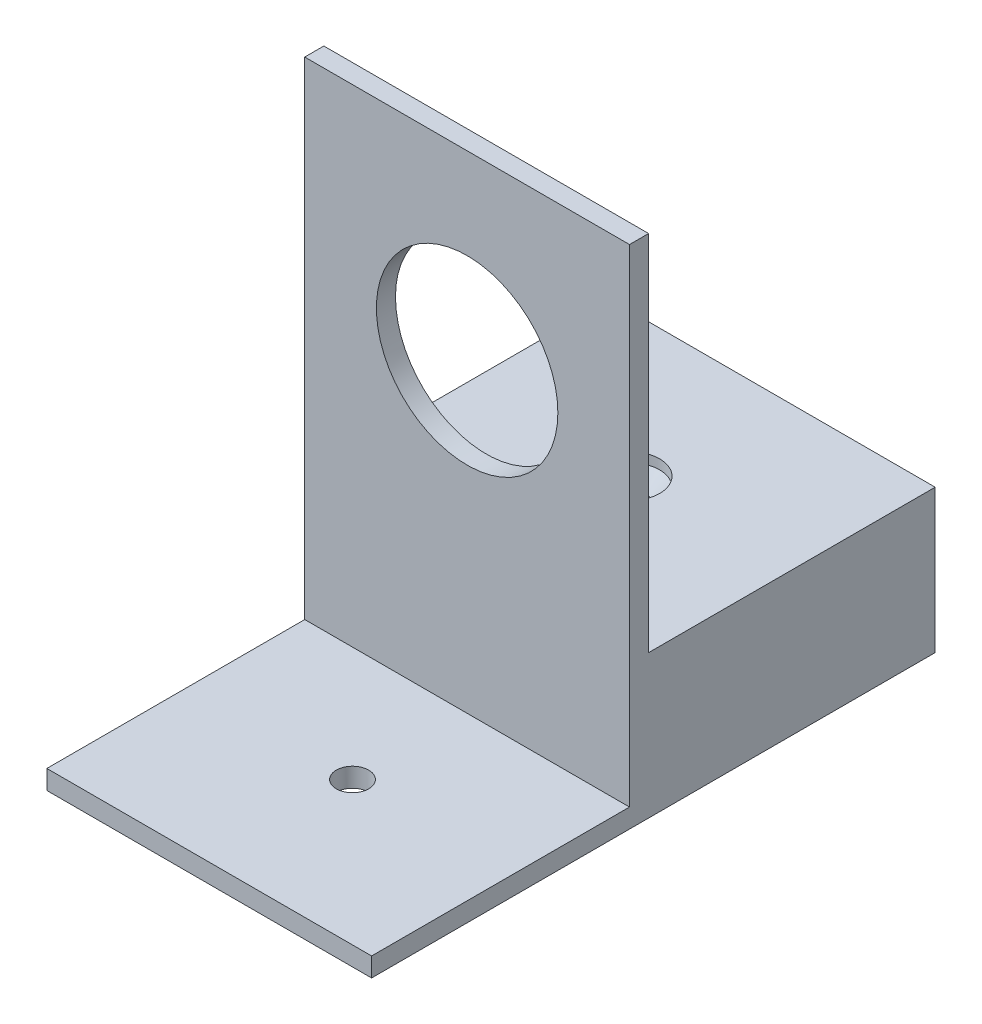
ISO-10303-21;
HEADER;
FILE_DESCRIPTION(('STEP AP214'),'2;1');
FILE_NAME('part.step','',(''),(''),'','','');
FILE_SCHEMA(('AUTOMOTIVE_DESIGN { 1 0 10303 214 1 1 1 1 }'));
ENDSEC;
DATA;
#1=APPLICATION_CONTEXT('core data for automotive mechanical design processes');
#2=APPLICATION_PROTOCOL_DEFINITION('international standard','automotive_design',2000,#1);
#3=PRODUCT_CONTEXT('',#1,'mechanical');
#4=PRODUCT('Part','Part','',(#3));
#5=PRODUCT_RELATED_PRODUCT_CATEGORY('part','',(#4));
#6=PRODUCT_DEFINITION_FORMATION('','',#4);
#7=PRODUCT_DEFINITION_CONTEXT('part definition',#1,'design');
#8=PRODUCT_DEFINITION('design','',#6,#7);
#9=PRODUCT_DEFINITION_SHAPE('','',#8);
#10=(LENGTH_UNIT() NAMED_UNIT(*) SI_UNIT(.MILLI.,.METRE.));
#11=(NAMED_UNIT(*) PLANE_ANGLE_UNIT() SI_UNIT($,.RADIAN.));
#12=(NAMED_UNIT(*) SI_UNIT($,.STERADIAN.) SOLID_ANGLE_UNIT());
#13=UNCERTAINTY_MEASURE_WITH_UNIT(LENGTH_MEASURE(1.E-05),#10,'distance_accuracy_value','');
#14=(GEOMETRIC_REPRESENTATION_CONTEXT(3) GLOBAL_UNCERTAINTY_ASSIGNED_CONTEXT((#13)) GLOBAL_UNIT_ASSIGNED_CONTEXT((#10,
#11,#12)) REPRESENTATION_CONTEXT('',''));
#15=CARTESIAN_POINT('',(0.,0.,0.));
#16=DIRECTION('',(0.,0.,1.));
#17=DIRECTION('',(1.,0.,0.));
#18=AXIS2_PLACEMENT_3D('',#15,#16,#17);
#19=CARTESIAN_POINT('',(0.,0.,2.));
#20=DIRECTION('',(0.,0.,-1.));
#21=DIRECTION('',(-1.,0.,0.));
#22=AXIS2_PLACEMENT_3D('',#19,#20,#21);
#23=PLANE('',#22);
#24=CARTESIAN_POINT('',(17.,34.,2.));
#25=DIRECTION('',(0.,0.,1.));
#26=DIRECTION('',(1.,0.,0.));
#27=AXIS2_PLACEMENT_3D('',#24,#25,#26);
#28=CIRCLE('',#27,9.5);
#29=CARTESIAN_POINT('',(26.5,34.,2.));
#30=VERTEX_POINT('',#29);
#31=EDGE_CURVE('E197',#30,#30,#28,.T.);
#32=ORIENTED_EDGE('',*,*,#31,.F.);
#33=EDGE_LOOP('',(#32));
#34=FACE_BOUND('',#33,.T.);
#35=DIRECTION('',(-1.,0.,0.));
#36=VECTOR('',#35,1.);
#37=CARTESIAN_POINT('',(0.,2.,2.));
#38=LINE('',#37,#36);
#39=CARTESIAN_POINT('',(34.,2.,2.));
#40=VERTEX_POINT('',#39);
#41=CARTESIAN_POINT('',(0.,2.,2.));
#42=VERTEX_POINT('',#41);
#43=EDGE_CURVE('E58',#40,#42,#38,.T.);
#44=ORIENTED_EDGE('',*,*,#43,.F.);
#45=DIRECTION('',(0.,1.,0.));
#46=VECTOR('',#45,1.);
#47=CARTESIAN_POINT('',(34.,0.,2.));
#48=LINE('',#47,#46);
#49=CARTESIAN_POINT('',(34.,53.,2.));
#50=VERTEX_POINT('',#49);
#51=EDGE_CURVE('E155',#40,#50,#48,.T.);
#52=ORIENTED_EDGE('',*,*,#51,.T.);
#53=DIRECTION('',(-1.,0.,0.));
#54=VECTOR('',#53,1.);
#55=CARTESIAN_POINT('',(0.,53.,2.));
#56=LINE('',#55,#54);
#57=CARTESIAN_POINT('',(0.,53.,2.));
#58=VERTEX_POINT('',#57);
#59=EDGE_CURVE('E168',#50,#58,#56,.T.);
#60=ORIENTED_EDGE('',*,*,#59,.T.);
#61=DIRECTION('',(0.,-1.,0.));
#62=VECTOR('',#61,1.);
#63=CARTESIAN_POINT('',(0.,0.,2.));
#64=LINE('',#63,#62);
#65=EDGE_CURVE('E173',#58,#42,#64,.T.);
#66=ORIENTED_EDGE('',*,*,#65,.T.);
#67=EDGE_LOOP('',(#44,#52,#60,#66));
#68=FACE_BOUND('',#67,.T.);
#69=ADVANCED_FACE('F33',(#34,#68),#23,.F.);
#70=CARTESIAN_POINT('',(0.,0.,2.));
#71=DIRECTION('',(1.,0.,0.));
#72=DIRECTION('',(0.,0.,-1.));
#73=AXIS2_PLACEMENT_3D('',#70,#71,#72);
#74=PLANE('',#73);
#75=DIRECTION('',(0.,-1.,0.));
#76=VECTOR('',#75,1.);
#77=CARTESIAN_POINT('',(0.,0.,0.));
#78=LINE('',#77,#76);
#79=CARTESIAN_POINT('',(0.,53.,0.));
#80=VERTEX_POINT('',#79);
#81=CARTESIAN_POINT('',(0.,15.,0.));
#82=VERTEX_POINT('',#81);
#83=EDGE_CURVE('E121',#80,#82,#78,.T.);
#84=ORIENTED_EDGE('',*,*,#83,.T.);
#85=DIRECTION('',(0.,0.,1.));
#86=VECTOR('',#85,1.);
#87=CARTESIAN_POINT('',(0.,15.,-30.));
#88=LINE('',#87,#86);
#89=CARTESIAN_POINT('',(0.,15.,-30.));
#90=VERTEX_POINT('',#89);
#91=EDGE_CURVE('E104',#90,#82,#88,.T.);
#92=ORIENTED_EDGE('',*,*,#91,.F.);
#93=DIRECTION('',(0.,1.,0.));
#94=VECTOR('',#93,1.);
#95=CARTESIAN_POINT('',(0.,0.,-30.));
#96=LINE('',#95,#94);
#97=CARTESIAN_POINT('',(0.,0.,-30.));
#98=VERTEX_POINT('',#97);
#99=EDGE_CURVE('E111',#98,#90,#96,.T.);
#100=ORIENTED_EDGE('',*,*,#99,.F.);
#101=DIRECTION('',(0.,0.,-1.));
#102=VECTOR('',#101,1.);
#103=CARTESIAN_POINT('',(0.,0.,2.));
#104=LINE('',#103,#102);
#105=CARTESIAN_POINT('',(0.,0.,29.));
#106=VERTEX_POINT('',#105);
#107=EDGE_CURVE('E11',#106,#98,#104,.T.);
#108=ORIENTED_EDGE('',*,*,#107,.F.);
#109=DIRECTION('',(0.,-1.,0.));
#110=VECTOR('',#109,1.);
#111=CARTESIAN_POINT('',(0.,0.,29.));
#112=LINE('',#111,#110);
#113=CARTESIAN_POINT('',(0.,2.,29.));
#114=VERTEX_POINT('',#113);
#115=EDGE_CURVE('E123',#114,#106,#112,.T.);
#116=ORIENTED_EDGE('',*,*,#115,.F.);
#117=DIRECTION('',(0.,0.,-1.));
#118=VECTOR('',#117,1.);
#119=CARTESIAN_POINT('',(0.,2.,29.));
#120=LINE('',#119,#118);
#121=EDGE_CURVE('E148',#114,#42,#120,.T.);
#122=ORIENTED_EDGE('',*,*,#121,.T.);
#123=ORIENTED_EDGE('',*,*,#65,.F.);
#124=DIRECTION('',(0.,0.,-1.));
#125=VECTOR('',#124,1.);
#126=CARTESIAN_POINT('',(0.,53.,2.));
#127=LINE('',#126,#125);
#128=EDGE_CURVE('E174',#58,#80,#127,.T.);
#129=ORIENTED_EDGE('',*,*,#128,.T.);
#130=EDGE_LOOP('',(#84,#92,#100,#108,#116,#122,#123,#129));
#131=FACE_BOUND('',#130,.T.);
#132=ADVANCED_FACE('F35',(#131),#74,.F.);
#133=CARTESIAN_POINT('',(0.,0.,2.));
#134=DIRECTION('',(0.,1.,0.));
#135=DIRECTION('',(0.,0.,1.));
#136=AXIS2_PLACEMENT_3D('',#133,#134,#135);
#137=PLANE('',#136);
#138=CARTESIAN_POINT('',(17.,0.,-15.));
#139=DIRECTION('',(0.,1.,0.));
#140=DIRECTION('',(0.,0.,1.));
#141=AXIS2_PLACEMENT_3D('',#138,#139,#140);
#142=CIRCLE('',#141,1.7);
#143=CARTESIAN_POINT('',(17.,0.,-13.3));
#144=VERTEX_POINT('',#143);
#145=EDGE_CURVE('E206',#144,#144,#142,.T.);
#146=ORIENTED_EDGE('',*,*,#145,.T.);
#147=EDGE_LOOP('',(#146));
#148=FACE_BOUND('',#147,.T.);
#149=CARTESIAN_POINT('',(17.,0.,14.));
#150=DIRECTION('',(0.,1.,0.));
#151=DIRECTION('',(0.,0.,1.));
#152=AXIS2_PLACEMENT_3D('',#149,#150,#151);
#153=CIRCLE('',#152,1.7);
#154=CARTESIAN_POINT('',(17.,0.,15.7));
#155=VERTEX_POINT('',#154);
#156=EDGE_CURVE('E203',#155,#155,#153,.T.);
#157=ORIENTED_EDGE('',*,*,#156,.T.);
#158=EDGE_LOOP('',(#157));
#159=FACE_BOUND('',#158,.T.);
#160=ORIENTED_EDGE('',*,*,#107,.T.);
#161=DIRECTION('',(-1.,0.,0.));
#162=VECTOR('',#161,1.);
#163=CARTESIAN_POINT('',(0.,0.,-30.));
#164=LINE('',#163,#162);
#165=CARTESIAN_POINT('',(34.,0.,-30.));
#166=VERTEX_POINT('',#165);
#167=EDGE_CURVE('E117',#166,#98,#164,.T.);
#168=ORIENTED_EDGE('',*,*,#167,.F.);
#169=DIRECTION('',(0.,0.,-1.));
#170=VECTOR('',#169,1.);
#171=CARTESIAN_POINT('',(34.,0.,2.));
#172=LINE('',#171,#170);
#173=CARTESIAN_POINT('',(34.,0.,29.));
#174=VERTEX_POINT('',#173);
#175=EDGE_CURVE('E42',#174,#166,#172,.T.);
#176=ORIENTED_EDGE('',*,*,#175,.F.);
#177=DIRECTION('',(1.,0.,0.));
#178=VECTOR('',#177,1.);
#179=CARTESIAN_POINT('',(0.,0.,29.));
#180=LINE('',#179,#178);
#181=EDGE_CURVE('E141',#106,#174,#180,.T.);
#182=ORIENTED_EDGE('',*,*,#181,.F.);
#183=EDGE_LOOP('',(#160,#168,#176,#182));
#184=FACE_BOUND('',#183,.T.);
#185=ADVANCED_FACE('F240',(#148,#159,#184),#137,.F.);
#186=CARTESIAN_POINT('',(34.,0.,2.));
#187=DIRECTION('',(-1.,0.,0.));
#188=DIRECTION('',(0.,0.,1.));
#189=AXIS2_PLACEMENT_3D('',#186,#187,#188);
#190=PLANE('',#189);
#191=ORIENTED_EDGE('',*,*,#175,.T.);
#192=DIRECTION('',(0.,-1.,0.));
#193=VECTOR('',#192,1.);
#194=CARTESIAN_POINT('',(34.,0.,-30.));
#195=LINE('',#194,#193);
#196=CARTESIAN_POINT('',(34.,15.,-30.));
#197=VERTEX_POINT('',#196);
#198=EDGE_CURVE('E110',#197,#166,#195,.T.);
#199=ORIENTED_EDGE('',*,*,#198,.F.);
#200=DIRECTION('',(0.,0.,1.));
#201=VECTOR('',#200,1.);
#202=CARTESIAN_POINT('',(34.,15.,-30.));
#203=LINE('',#202,#201);
#204=CARTESIAN_POINT('',(34.,15.,0.));
#205=VERTEX_POINT('',#204);
#206=EDGE_CURVE('E106',#197,#205,#203,.T.);
#207=ORIENTED_EDGE('',*,*,#206,.T.);
#208=DIRECTION('',(0.,1.,0.));
#209=VECTOR('',#208,1.);
#210=CARTESIAN_POINT('',(34.,0.,0.));
#211=LINE('',#210,#209);
#212=CARTESIAN_POINT('',(34.,53.,0.));
#213=VERTEX_POINT('',#212);
#214=EDGE_CURVE('E132',#205,#213,#211,.T.);
#215=ORIENTED_EDGE('',*,*,#214,.T.);
#216=DIRECTION('',(0.,0.,-1.));
#217=VECTOR('',#216,1.);
#218=CARTESIAN_POINT('',(34.,53.,2.));
#219=LINE('',#218,#217);
#220=EDGE_CURVE('E176',#50,#213,#219,.T.);
#221=ORIENTED_EDGE('',*,*,#220,.F.);
#222=ORIENTED_EDGE('',*,*,#51,.F.);
#223=DIRECTION('',(0.,0.,-1.));
#224=VECTOR('',#223,1.);
#225=CARTESIAN_POINT('',(34.,2.,29.));
#226=LINE('',#225,#224);
#227=CARTESIAN_POINT('',(34.,2.,29.));
#228=VERTEX_POINT('',#227);
#229=EDGE_CURVE('E159',#228,#40,#226,.T.);
#230=ORIENTED_EDGE('',*,*,#229,.F.);
#231=DIRECTION('',(0.,1.,0.));
#232=VECTOR('',#231,1.);
#233=CARTESIAN_POINT('',(34.,0.,29.));
#234=LINE('',#233,#232);
#235=EDGE_CURVE('E144',#174,#228,#234,.T.);
#236=ORIENTED_EDGE('',*,*,#235,.F.);
#237=EDGE_LOOP('',(#191,#199,#207,#215,#221,#222,#230,#236));
#238=FACE_BOUND('',#237,.T.);
#239=ADVANCED_FACE('F194',(#238),#190,.F.);
#240=CARTESIAN_POINT('',(0.,53.,2.));
#241=DIRECTION('',(0.,-1.,0.));
#242=DIRECTION('',(0.,0.,-1.));
#243=AXIS2_PLACEMENT_3D('',#240,#241,#242);
#244=PLANE('',#243);
#245=DIRECTION('',(-1.,0.,0.));
#246=VECTOR('',#245,1.);
#247=CARTESIAN_POINT('',(0.,53.,0.));
#248=LINE('',#247,#246);
#249=EDGE_CURVE('E171',#213,#80,#248,.T.);
#250=ORIENTED_EDGE('',*,*,#249,.T.);
#251=ORIENTED_EDGE('',*,*,#128,.F.);
#252=ORIENTED_EDGE('',*,*,#59,.F.);
#253=ORIENTED_EDGE('',*,*,#220,.T.);
#254=EDGE_LOOP('',(#250,#251,#252,#253));
#255=FACE_BOUND('',#254,.T.);
#256=ADVANCED_FACE('F184',(#255),#244,.F.);
#257=CARTESIAN_POINT('',(0.,0.,0.));
#258=DIRECTION('',(0.,0.,-1.));
#259=DIRECTION('',(-1.,0.,0.));
#260=AXIS2_PLACEMENT_3D('',#257,#258,#259);
#261=PLANE('',#260);
#262=CARTESIAN_POINT('',(17.,34.,0.));
#263=DIRECTION('',(0.,0.,-1.));
#264=DIRECTION('',(-1.,0.,0.));
#265=AXIS2_PLACEMENT_3D('',#262,#263,#264);
#266=CIRCLE('',#265,9.5);
#267=CARTESIAN_POINT('',(7.5,34.,0.));
#268=VERTEX_POINT('',#267);
#269=EDGE_CURVE('E37',#268,#268,#266,.T.);
#270=ORIENTED_EDGE('',*,*,#269,.F.);
#271=EDGE_LOOP('',(#270));
#272=FACE_BOUND('',#271,.T.);
#273=DIRECTION('',(1.,0.,0.));
#274=VECTOR('',#273,1.);
#275=CARTESIAN_POINT('',(0.,15.,0.));
#276=LINE('',#275,#274);
#277=EDGE_CURVE('E50',#82,#205,#276,.T.);
#278=ORIENTED_EDGE('',*,*,#277,.F.);
#279=ORIENTED_EDGE('',*,*,#83,.F.);
#280=ORIENTED_EDGE('',*,*,#249,.F.);
#281=ORIENTED_EDGE('',*,*,#214,.F.);
#282=EDGE_LOOP('',(#278,#279,#280,#281));
#283=FACE_BOUND('',#282,.T.);
#284=ADVANCED_FACE('F195',(#272,#283),#261,.T.);
#285=CARTESIAN_POINT('',(0.,2.,29.));
#286=DIRECTION('',(0.,-1.,0.));
#287=DIRECTION('',(0.,0.,-1.));
#288=AXIS2_PLACEMENT_3D('',#285,#286,#287);
#289=PLANE('',#288);
#290=CARTESIAN_POINT('',(17.,2.,14.));
#291=DIRECTION('',(0.,-1.,0.));
#292=DIRECTION('',(0.,0.,-1.));
#293=AXIS2_PLACEMENT_3D('',#290,#291,#292);
#294=CIRCLE('',#293,1.7);
#295=CARTESIAN_POINT('',(17.,2.,12.3));
#296=VERTEX_POINT('',#295);
#297=EDGE_CURVE('E200',#296,#296,#294,.T.);
#298=ORIENTED_EDGE('',*,*,#297,.T.);
#299=EDGE_LOOP('',(#298));
#300=FACE_BOUND('',#299,.T.);
#301=ORIENTED_EDGE('',*,*,#43,.T.);
#302=ORIENTED_EDGE('',*,*,#121,.F.);
#303=DIRECTION('',(-1.,0.,0.));
#304=VECTOR('',#303,1.);
#305=CARTESIAN_POINT('',(0.,2.,29.));
#306=LINE('',#305,#304);
#307=EDGE_CURVE('E146',#228,#114,#306,.T.);
#308=ORIENTED_EDGE('',*,*,#307,.F.);
#309=ORIENTED_EDGE('',*,*,#229,.T.);
#310=EDGE_LOOP('',(#301,#302,#308,#309));
#311=FACE_BOUND('',#310,.T.);
#312=ADVANCED_FACE('F190',(#300,#311),#289,.F.);
#313=CARTESIAN_POINT('',(0.,0.,29.));
#314=DIRECTION('',(0.,0.,-1.));
#315=DIRECTION('',(-1.,0.,0.));
#316=AXIS2_PLACEMENT_3D('',#313,#314,#315);
#317=PLANE('',#316);
#318=ORIENTED_EDGE('',*,*,#115,.T.);
#319=ORIENTED_EDGE('',*,*,#181,.T.);
#320=ORIENTED_EDGE('',*,*,#235,.T.);
#321=ORIENTED_EDGE('',*,*,#307,.T.);
#322=EDGE_LOOP('',(#318,#319,#320,#321));
#323=FACE_BOUND('',#322,.T.);
#324=ADVANCED_FACE('F222',(#323),#317,.F.);
#325=CARTESIAN_POINT('',(0.,15.,-30.));
#326=DIRECTION('',(0.,-1.,0.));
#327=DIRECTION('',(1.,0.,0.));
#328=AXIS2_PLACEMENT_3D('',#325,#326,#327);
#329=PLANE('',#328);
#330=CARTESIAN_POINT('',(17.,15.,-15.));
#331=DIRECTION('',(0.,1.,0.));
#332=DIRECTION('',(0.,0.,1.));
#333=AXIS2_PLACEMENT_3D('',#330,#331,#332);
#334=CIRCLE('',#333,3.15);
#335=CARTESIAN_POINT('',(17.,15.,-11.85));
#336=VERTEX_POINT('',#335);
#337=EDGE_CURVE('E215',#336,#336,#334,.T.);
#338=ORIENTED_EDGE('',*,*,#337,.F.);
#339=EDGE_LOOP('',(#338));
#340=FACE_BOUND('',#339,.T.);
#341=ORIENTED_EDGE('',*,*,#277,.T.);
#342=ORIENTED_EDGE('',*,*,#206,.F.);
#343=DIRECTION('',(1.,0.,0.));
#344=VECTOR('',#343,1.);
#345=CARTESIAN_POINT('',(0.,15.,-30.));
#346=LINE('',#345,#344);
#347=EDGE_CURVE('E100',#90,#197,#346,.T.);
#348=ORIENTED_EDGE('',*,*,#347,.F.);
#349=ORIENTED_EDGE('',*,*,#91,.T.);
#350=EDGE_LOOP('',(#341,#342,#348,#349));
#351=FACE_BOUND('',#350,.T.);
#352=ADVANCED_FACE('F102',(#340,#351),#329,.F.);
#353=CARTESIAN_POINT('',(0.,0.,-30.));
#354=DIRECTION('',(0.,0.,-1.));
#355=DIRECTION('',(-1.,0.,0.));
#356=AXIS2_PLACEMENT_3D('',#353,#354,#355);
#357=PLANE('',#356);
#358=ORIENTED_EDGE('',*,*,#99,.T.);
#359=ORIENTED_EDGE('',*,*,#347,.T.);
#360=ORIENTED_EDGE('',*,*,#198,.T.);
#361=ORIENTED_EDGE('',*,*,#167,.T.);
#362=EDGE_LOOP('',(#358,#359,#360,#361));
#363=FACE_BOUND('',#362,.T.);
#364=ADVANCED_FACE('F115',(#363),#357,.T.);
#365=CARTESIAN_POINT('',(17.,34.,-30.000025));
#366=DIRECTION('',(0.,0.,1.));
#367=DIRECTION('',(1.,0.,0.));
#368=AXIS2_PLACEMENT_3D('',#365,#366,#367);
#369=CYLINDRICAL_SURFACE('',#368,9.5);
#370=ORIENTED_EDGE('',*,*,#269,.T.);
#371=EDGE_LOOP('',(#370));
#372=FACE_BOUND('',#371,.T.);
#373=ORIENTED_EDGE('',*,*,#31,.T.);
#374=EDGE_LOOP('',(#373));
#375=FACE_BOUND('',#374,.T.);
#376=ADVANCED_FACE('F229',(#372,#375),#369,.F.);
#377=CARTESIAN_POINT('',(17.,15.,14.));
#378=DIRECTION('',(0.,1.,0.));
#379=DIRECTION('',(0.,0.,1.));
#380=AXIS2_PLACEMENT_3D('',#377,#378,#379);
#381=CYLINDRICAL_SURFACE('',#380,1.7);
#382=ORIENTED_EDGE('',*,*,#156,.F.);
#383=EDGE_LOOP('',(#382));
#384=FACE_BOUND('',#383,.T.);
#385=ORIENTED_EDGE('',*,*,#297,.F.);
#386=EDGE_LOOP('',(#385));
#387=FACE_BOUND('',#386,.T.);
#388=ADVANCED_FACE('F261',(#384,#387),#381,.F.);
#389=CARTESIAN_POINT('',(17.,15.,-15.));
#390=DIRECTION('',(0.,1.,0.));
#391=DIRECTION('',(0.,0.,1.));
#392=AXIS2_PLACEMENT_3D('',#389,#390,#391);
#393=CYLINDRICAL_SURFACE('',#392,1.7);
#394=ORIENTED_EDGE('',*,*,#145,.F.);
#395=EDGE_LOOP('',(#394));
#396=FACE_BOUND('',#395,.T.);
#397=CARTESIAN_POINT('',(17.,12.55,-15.));
#398=DIRECTION('',(0.,1.,0.));
#399=DIRECTION('',(0.,0.,1.));
#400=AXIS2_PLACEMENT_3D('',#397,#398,#399);
#401=CIRCLE('',#400,1.7);
#402=CARTESIAN_POINT('',(17.,12.55,-13.3));
#403=VERTEX_POINT('',#402);
#404=EDGE_CURVE('E209',#403,#403,#401,.T.);
#405=ORIENTED_EDGE('',*,*,#404,.T.);
#406=EDGE_LOOP('',(#405));
#407=FACE_BOUND('',#406,.T.);
#408=ADVANCED_FACE('F264',(#396,#407),#393,.F.);
#409=CARTESIAN_POINT('',(17.,14.,-15.));
#410=DIRECTION('',(0.,1.,0.));
#411=DIRECTION('',(0.,0.,1.));
#412=AXIS2_PLACEMENT_3D('',#409,#410,#411);
#413=CONICAL_SURFACE('',#412,3.15,0.785398163397448);
#414=ORIENTED_EDGE('',*,*,#404,.F.);
#415=EDGE_LOOP('',(#414));
#416=FACE_BOUND('',#415,.T.);
#417=CARTESIAN_POINT('',(17.,14.,-15.));
#418=DIRECTION('',(0.,1.,0.));
#419=DIRECTION('',(0.,0.,1.));
#420=AXIS2_PLACEMENT_3D('',#417,#418,#419);
#421=CIRCLE('',#420,3.15);
#422=CARTESIAN_POINT('',(17.,14.,-11.85));
#423=VERTEX_POINT('',#422);
#424=EDGE_CURVE('E212',#423,#423,#421,.T.);
#425=ORIENTED_EDGE('',*,*,#424,.T.);
#426=EDGE_LOOP('',(#425));
#427=FACE_BOUND('',#426,.T.);
#428=ADVANCED_FACE('F306',(#416,#427),#413,.F.);
#429=CARTESIAN_POINT('',(17.,15.,-15.));
#430=DIRECTION('',(0.,1.,0.));
#431=DIRECTION('',(0.,0.,1.));
#432=AXIS2_PLACEMENT_3D('',#429,#430,#431);
#433=CYLINDRICAL_SURFACE('',#432,3.15);
#434=ORIENTED_EDGE('',*,*,#424,.F.);
#435=EDGE_LOOP('',(#434));
#436=FACE_BOUND('',#435,.T.);
#437=ORIENTED_EDGE('',*,*,#337,.T.);
#438=EDGE_LOOP('',(#437));
#439=FACE_BOUND('',#438,.T.);
#440=ADVANCED_FACE('F219',(#436,#439),#433,.F.);
#441=CLOSED_SHELL('',(#69,#132,#185,#239,#256,#284,#312,#324,#352,#364,#376,#388,#408,#428,#440));
#442=MANIFOLD_SOLID_BREP('B2',#441);
#443=ADVANCED_BREP_SHAPE_REPRESENTATION('',(#18,#442),#14);
#444=SHAPE_DEFINITION_REPRESENTATION(#9,#443);
ENDSEC;
END-ISO-10303-21;
